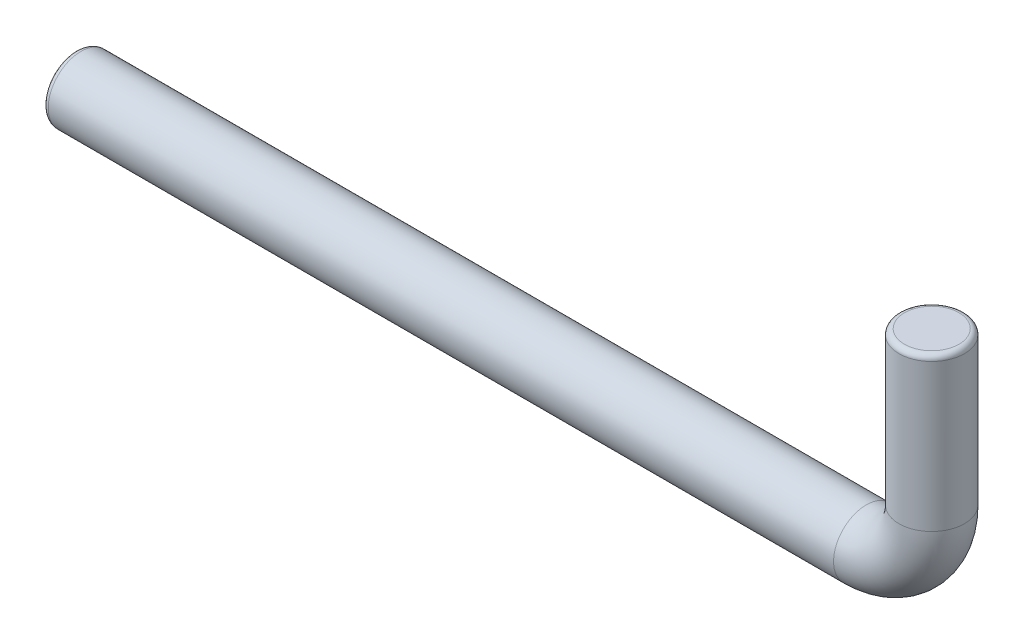
ISO-10303-21;
HEADER;
FILE_DESCRIPTION(('STEP AP214'),'2;1');
FILE_NAME('part.step','',(''),(''),'','','');
FILE_SCHEMA(('AUTOMOTIVE_DESIGN { 1 0 10303 214 1 1 1 1 }'));
ENDSEC;
DATA;
#1=APPLICATION_CONTEXT('core data for automotive mechanical design processes');
#2=APPLICATION_PROTOCOL_DEFINITION('international standard','automotive_design',2000,#1);
#3=PRODUCT_CONTEXT('',#1,'mechanical');
#4=PRODUCT('Part','Part','',(#3));
#5=PRODUCT_RELATED_PRODUCT_CATEGORY('part','',(#4));
#6=PRODUCT_DEFINITION_FORMATION('','',#4);
#7=PRODUCT_DEFINITION_CONTEXT('part definition',#1,'design');
#8=PRODUCT_DEFINITION('design','',#6,#7);
#9=PRODUCT_DEFINITION_SHAPE('','',#8);
#10=(LENGTH_UNIT() NAMED_UNIT(*) SI_UNIT(.MILLI.,.METRE.));
#11=(NAMED_UNIT(*) PLANE_ANGLE_UNIT() SI_UNIT($,.RADIAN.));
#12=(NAMED_UNIT(*) SI_UNIT($,.STERADIAN.) SOLID_ANGLE_UNIT());
#13=UNCERTAINTY_MEASURE_WITH_UNIT(LENGTH_MEASURE(1.E-05),#10,'distance_accuracy_value','');
#14=(GEOMETRIC_REPRESENTATION_CONTEXT(3) GLOBAL_UNCERTAINTY_ASSIGNED_CONTEXT((#13)) GLOBAL_UNIT_ASSIGNED_CONTEXT((#10,
#11,#12)) REPRESENTATION_CONTEXT('',''));
#15=CARTESIAN_POINT('',(0.,0.,0.));
#16=DIRECTION('',(0.,0.,1.));
#17=DIRECTION('',(1.,0.,0.));
#18=AXIS2_PLACEMENT_3D('',#15,#16,#17);
#19=CARTESIAN_POINT('',(0.,0.,0.));
#20=DIRECTION('',(1.,0.,0.));
#21=DIRECTION('',(0.,0.,-1.));
#22=AXIS2_PLACEMENT_3D('',#19,#20,#21);
#23=PLANE('',#22);
#24=CARTESIAN_POINT('',(0.,0.,0.));
#25=DIRECTION('',(1.,0.,0.));
#26=DIRECTION('',(0.,0.,-1.));
#27=AXIS2_PLACEMENT_3D('',#24,#25,#26);
#28=CIRCLE('',#27,2.5);
#29=CARTESIAN_POINT('',(0.,0.,-2.5));
#30=VERTEX_POINT('',#29);
#31=EDGE_CURVE('E43',#30,#30,#28,.F.);
#32=ORIENTED_EDGE('',*,*,#31,.T.);
#33=EDGE_LOOP('',(#32));
#34=FACE_BOUND('',#33,.T.);
#35=ADVANCED_FACE('F32',(#34),#23,.F.);
#36=CARTESIAN_POINT('',(78.5,20.0000000000002,0.));
#37=DIRECTION('',(0.,1.,0.));
#38=DIRECTION('',(0.,0.,-1.));
#39=AXIS2_PLACEMENT_3D('',#36,#37,#38);
#40=PLANE('',#39);
#41=CARTESIAN_POINT('',(78.5,20.0000000000002,0.));
#42=DIRECTION('',(0.,1.,0.));
#43=DIRECTION('',(0.,0.,1.));
#44=AXIS2_PLACEMENT_3D('',#41,#42,#43);
#45=CIRCLE('',#44,2.5);
#46=CARTESIAN_POINT('',(78.5,20.0000000000002,2.5));
#47=VERTEX_POINT('',#46);
#48=EDGE_CURVE('E39',#47,#47,#45,.T.);
#49=ORIENTED_EDGE('',*,*,#48,.T.);
#50=EDGE_LOOP('',(#49));
#51=FACE_BOUND('',#50,.T.);
#52=ADVANCED_FACE('F63',(#51),#40,.T.);
#53=CARTESIAN_POINT('',(0.,0.,0.));
#54=DIRECTION('',(1.,0.,0.));
#55=DIRECTION('',(0.,0.,-1.));
#56=AXIS2_PLACEMENT_3D('',#53,#54,#55);
#57=CYLINDRICAL_SURFACE('',#56,3.);
#58=CARTESIAN_POINT('',(0.499999999999945,0.,0.));
#59=DIRECTION('',(1.,0.,0.));
#60=DIRECTION('',(0.,0.,-1.));
#61=AXIS2_PLACEMENT_3D('',#58,#59,#60);
#62=CIRCLE('',#61,3.);
#63=CARTESIAN_POINT('',(0.499999999999945,0.,-3.));
#64=VERTEX_POINT('',#63);
#65=EDGE_CURVE('E47',#64,#64,#62,.T.);
#66=ORIENTED_EDGE('',*,*,#65,.T.);
#67=EDGE_LOOP('',(#66));
#68=FACE_BOUND('',#67,.T.);
#69=CARTESIAN_POINT('',(72.5,0.,0.));
#70=DIRECTION('',(1.,0.,0.));
#71=DIRECTION('',(0.,0.,-1.));
#72=AXIS2_PLACEMENT_3D('',#69,#70,#71);
#73=CIRCLE('',#72,3.);
#74=CARTESIAN_POINT('',(72.5,-3.,1.11022302462515E-13));
#75=VERTEX_POINT('',#74);
#76=EDGE_CURVE('E55',#75,#75,#73,.T.);
#77=ORIENTED_EDGE('',*,*,#76,.F.);
#78=EDGE_LOOP('',(#77));
#79=FACE_BOUND('',#78,.T.);
#80=ADVANCED_FACE('F61',(#68,#79),#57,.T.);
#81=CARTESIAN_POINT('',(72.5,6.00000000000001,-2.22044604925031E-13));
#82=DIRECTION('',(0.,0.,1.));
#83=DIRECTION('',(1.,0.,0.));
#84=AXIS2_PLACEMENT_3D('',#81,#82,#83);
#85=TOROIDAL_SURFACE('',#84,6.,3.);
#86=CARTESIAN_POINT('',(78.5,6.00000000000023,-2.22044604925031E-13));
#87=DIRECTION('',(0.,1.,0.));
#88=DIRECTION('',(0.,0.,-1.));
#89=AXIS2_PLACEMENT_3D('',#86,#87,#88);
#90=CIRCLE('',#89,3.);
#91=CARTESIAN_POINT('',(81.5,6.00000000000034,-2.22044604925031E-13));
#92=VERTEX_POINT('',#91);
#93=EDGE_CURVE('E52',#92,#92,#90,.T.);
#94=CARTESIAN_POINT('',(72.5,6.00000000000001,-2.22044604925031E-13));
#95=DIRECTION('',(0.,0.,1.));
#96=DIRECTION('',(1.,0.,0.));
#97=AXIS2_PLACEMENT_3D('',#94,#95,#96);
#98=CIRCLE('',#97,9.);
#99=EDGE_CURVE('',#75,#92,#98,.T.);
#100=ORIENTED_EDGE('',*,*,#76,.T.);
#101=ORIENTED_EDGE('',*,*,#93,.F.);
#102=ORIENTED_EDGE('',*,*,#99,.T.);
#103=ORIENTED_EDGE('',*,*,#99,.F.);
#104=EDGE_LOOP('',(#100,#102,#101,#103));
#105=FACE_BOUND('',#104,.T.);
#106=ADVANCED_FACE('F59',(#105),#85,.T.);
#107=CARTESIAN_POINT('',(78.5,6.00000000000023,-2.22044604925031E-13));
#108=DIRECTION('',(0.,1.,0.));
#109=DIRECTION('',(0.,0.,1.));
#110=AXIS2_PLACEMENT_3D('',#107,#108,#109);
#111=CYLINDRICAL_SURFACE('',#110,3.);
#112=CARTESIAN_POINT('',(78.5,19.5000000000003,0.));
#113=DIRECTION('',(0.,1.,0.));
#114=DIRECTION('',(0.,0.,1.));
#115=AXIS2_PLACEMENT_3D('',#112,#113,#114);
#116=CIRCLE('',#115,3.);
#117=CARTESIAN_POINT('',(78.5,19.5000000000003,3.));
#118=VERTEX_POINT('',#117);
#119=EDGE_CURVE('E10',#118,#118,#116,.F.);
#120=ORIENTED_EDGE('',*,*,#119,.T.);
#121=EDGE_LOOP('',(#120));
#122=FACE_BOUND('',#121,.T.);
#123=ORIENTED_EDGE('',*,*,#93,.T.);
#124=EDGE_LOOP('',(#123));
#125=FACE_BOUND('',#124,.T.);
#126=ADVANCED_FACE('F70',(#122,#125),#111,.T.);
#127=CARTESIAN_POINT('',(0.499999999999945,0.,0.));
#128=DIRECTION('',(1.,0.,0.));
#129=DIRECTION('',(0.,0.,-1.));
#130=AXIS2_PLACEMENT_3D('',#127,#128,#129);
#131=TOROIDAL_SURFACE('',#130,2.5,0.5);
#132=ORIENTED_EDGE('',*,*,#31,.F.);
#133=EDGE_LOOP('',(#132));
#134=FACE_BOUND('',#133,.T.);
#135=ORIENTED_EDGE('',*,*,#65,.F.);
#136=EDGE_LOOP('',(#135));
#137=FACE_BOUND('',#136,.T.);
#138=ADVANCED_FACE('F75',(#134,#137),#131,.T.);
#139=CARTESIAN_POINT('',(78.5,19.5000000000003,0.));
#140=DIRECTION('',(0.,1.,0.));
#141=DIRECTION('',(0.,0.,1.));
#142=AXIS2_PLACEMENT_3D('',#139,#140,#141);
#143=TOROIDAL_SURFACE('',#142,2.5,0.5);
#144=ORIENTED_EDGE('',*,*,#119,.F.);
#145=EDGE_LOOP('',(#144));
#146=FACE_BOUND('',#145,.T.);
#147=ORIENTED_EDGE('',*,*,#48,.F.);
#148=EDGE_LOOP('',(#147));
#149=FACE_BOUND('',#148,.T.);
#150=ADVANCED_FACE('F34',(#146,#149),#143,.T.);
#151=CLOSED_SHELL('',(#35,#52,#80,#106,#126,#138,#150));
#152=MANIFOLD_SOLID_BREP('B2',#151);
#153=ADVANCED_BREP_SHAPE_REPRESENTATION('',(#18,#152),#14);
#154=SHAPE_DEFINITION_REPRESENTATION(#9,#153);
ENDSEC;
END-ISO-10303-21;
